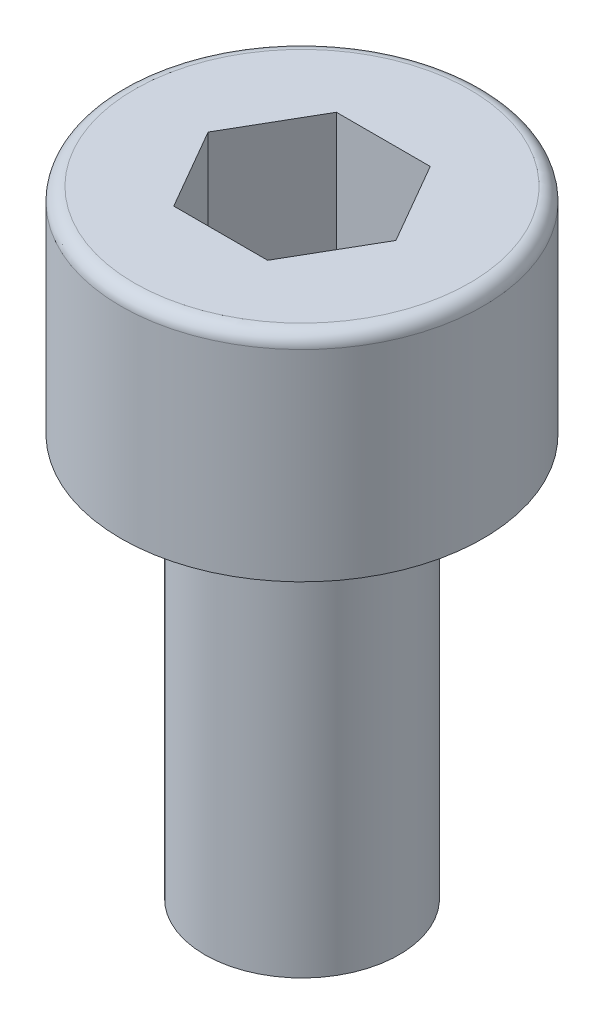
ISO-10303-21;
HEADER;
FILE_DESCRIPTION(('STEP AP214'),'2;1');
FILE_NAME('part.step','',(''),(''),'','','');
FILE_SCHEMA(('AUTOMOTIVE_DESIGN { 1 0 10303 214 1 1 1 1 }'));
ENDSEC;
DATA;
#1=APPLICATION_CONTEXT('core data for automotive mechanical design processes');
#2=APPLICATION_PROTOCOL_DEFINITION('international standard','automotive_design',2000,#1);
#3=PRODUCT_CONTEXT('',#1,'mechanical');
#4=PRODUCT('Part','Part','',(#3));
#5=PRODUCT_RELATED_PRODUCT_CATEGORY('part','',(#4));
#6=PRODUCT_DEFINITION_FORMATION('','',#4);
#7=PRODUCT_DEFINITION_CONTEXT('part definition',#1,'design');
#8=PRODUCT_DEFINITION('design','',#6,#7);
#9=PRODUCT_DEFINITION_SHAPE('','',#8);
#10=(LENGTH_UNIT() NAMED_UNIT(*) SI_UNIT(.MILLI.,.METRE.));
#11=(NAMED_UNIT(*) PLANE_ANGLE_UNIT() SI_UNIT($,.RADIAN.));
#12=(NAMED_UNIT(*) SI_UNIT($,.STERADIAN.) SOLID_ANGLE_UNIT());
#13=UNCERTAINTY_MEASURE_WITH_UNIT(LENGTH_MEASURE(1.E-05),#10,'distance_accuracy_value','');
#14=(GEOMETRIC_REPRESENTATION_CONTEXT(3) GLOBAL_UNCERTAINTY_ASSIGNED_CONTEXT((#13)) GLOBAL_UNIT_ASSIGNED_CONTEXT((#10,
#11,#12)) REPRESENTATION_CONTEXT('',''));
#15=CARTESIAN_POINT('',(0.,0.,0.));
#16=DIRECTION('',(0.,0.,1.));
#17=DIRECTION('',(1.,0.,0.));
#18=AXIS2_PLACEMENT_3D('',#15,#16,#17);
#19=CARTESIAN_POINT('',(0.,3.2,0.));
#20=DIRECTION('',(0.,-1.,0.));
#21=DIRECTION('',(0.,0.,-1.));
#22=AXIS2_PLACEMENT_3D('',#19,#20,#21);
#23=CYLINDRICAL_SURFACE('',#22,2.7);
#24=CARTESIAN_POINT('',(0.,3.,0.));
#25=DIRECTION('',(0.,1.,0.));
#26=DIRECTION('',(0.,0.,1.));
#27=AXIS2_PLACEMENT_3D('',#24,#25,#26);
#28=CIRCLE('',#27,2.7);
#29=CARTESIAN_POINT('',(0.,3.,2.7));
#30=VERTEX_POINT('',#29);
#31=EDGE_CURVE('E37',#30,#30,#28,.F.);
#32=ORIENTED_EDGE('',*,*,#31,.T.);
#33=EDGE_LOOP('',(#32));
#34=FACE_BOUND('',#33,.T.);
#35=CARTESIAN_POINT('',(0.,0.,0.));
#36=DIRECTION('',(0.,1.,0.));
#37=DIRECTION('',(0.,0.,1.));
#38=AXIS2_PLACEMENT_3D('',#35,#36,#37);
#39=CIRCLE('',#38,2.7);
#40=CARTESIAN_POINT('',(0.,0.,2.7));
#41=VERTEX_POINT('',#40);
#42=EDGE_CURVE('E137',#41,#41,#39,.T.);
#43=ORIENTED_EDGE('',*,*,#42,.T.);
#44=EDGE_LOOP('',(#43));
#45=FACE_BOUND('',#44,.T.);
#46=ADVANCED_FACE('F33',(#34,#45),#23,.T.);
#47=CARTESIAN_POINT('',(0.,3.2,0.));
#48=DIRECTION('',(0.,1.,0.));
#49=DIRECTION('',(0.,0.,1.));
#50=AXIS2_PLACEMENT_3D('',#47,#48,#49);
#51=PLANE('',#50);
#52=CARTESIAN_POINT('',(0.,3.2,0.));
#53=DIRECTION('',(0.,1.,0.));
#54=DIRECTION('',(0.,0.,1.));
#55=AXIS2_PLACEMENT_3D('',#52,#53,#54);
#56=CIRCLE('',#55,2.5);
#57=CARTESIAN_POINT('',(0.,3.2,2.5));
#58=VERTEX_POINT('',#57);
#59=EDGE_CURVE('E144',#58,#58,#56,.T.);
#60=ORIENTED_EDGE('',*,*,#59,.T.);
#61=EDGE_LOOP('',(#60));
#62=FACE_BOUND('',#61,.T.);
#63=DIRECTION('',(0.5,0.,-0.866025403784439));
#64=VECTOR('',#63,1.);
#65=CARTESIAN_POINT('',(0.7,3.2,1.21243556529821));
#66=LINE('',#65,#64);
#67=CARTESIAN_POINT('',(0.7,3.2,1.21243556529821));
#68=VERTEX_POINT('',#67);
#69=CARTESIAN_POINT('',(1.4,3.2,0.));
#70=VERTEX_POINT('',#69);
#71=EDGE_CURVE('E49',#68,#70,#66,.T.);
#72=ORIENTED_EDGE('',*,*,#71,.F.);
#73=DIRECTION('',(1.,0.,0.));
#74=VECTOR('',#73,1.);
#75=CARTESIAN_POINT('',(-0.7,3.2,1.21243556529821));
#76=LINE('',#75,#74);
#77=CARTESIAN_POINT('',(-0.7,3.2,1.21243556529821));
#78=VERTEX_POINT('',#77);
#79=EDGE_CURVE('E133',#78,#68,#76,.T.);
#80=ORIENTED_EDGE('',*,*,#79,.F.);
#81=DIRECTION('',(0.5,0.,0.866025403784439));
#82=VECTOR('',#81,1.);
#83=CARTESIAN_POINT('',(-1.4,3.2,0.));
#84=LINE('',#83,#82);
#85=CARTESIAN_POINT('',(-1.4,3.2,0.));
#86=VERTEX_POINT('',#85);
#87=EDGE_CURVE('E131',#86,#78,#84,.T.);
#88=ORIENTED_EDGE('',*,*,#87,.F.);
#89=DIRECTION('',(-0.5,0.,0.866025403784439));
#90=VECTOR('',#89,1.);
#91=CARTESIAN_POINT('',(-0.700000000000001,3.2,-1.21243556529821));
#92=LINE('',#91,#90);
#93=CARTESIAN_POINT('',(-0.700000000000001,3.2,-1.21243556529821));
#94=VERTEX_POINT('',#93);
#95=EDGE_CURVE('E97',#94,#86,#92,.T.);
#96=ORIENTED_EDGE('',*,*,#95,.F.);
#97=DIRECTION('',(-1.,0.,0.));
#98=VECTOR('',#97,1.);
#99=CARTESIAN_POINT('',(0.699999999999999,3.2,-1.21243556529821));
#100=LINE('',#99,#98);
#101=CARTESIAN_POINT('',(0.699999999999999,3.2,-1.21243556529821));
#102=VERTEX_POINT('',#101);
#103=EDGE_CURVE('E127',#102,#94,#100,.T.);
#104=ORIENTED_EDGE('',*,*,#103,.F.);
#105=DIRECTION('',(-0.5,0.,-0.866025403784439));
#106=VECTOR('',#105,1.);
#107=CARTESIAN_POINT('',(1.4,3.2,0.));
#108=LINE('',#107,#106);
#109=EDGE_CURVE('E123',#70,#102,#108,.T.);
#110=ORIENTED_EDGE('',*,*,#109,.F.);
#111=EDGE_LOOP('',(#72,#80,#88,#96,#104,#110));
#112=FACE_BOUND('',#111,.T.);
#113=ADVANCED_FACE('F166',(#62,#112),#51,.T.);
#114=CARTESIAN_POINT('',(0.,0.,0.));
#115=DIRECTION('',(0.,1.,0.));
#116=DIRECTION('',(0.,0.,1.));
#117=AXIS2_PLACEMENT_3D('',#114,#115,#116);
#118=PLANE('',#117);
#119=CARTESIAN_POINT('',(0.,0.,0.));
#120=DIRECTION('',(0.,-1.,0.));
#121=DIRECTION('',(0.,0.,-1.));
#122=AXIS2_PLACEMENT_3D('',#119,#120,#121);
#123=CIRCLE('',#122,1.45);
#124=CARTESIAN_POINT('',(0.,0.,-1.45));
#125=VERTEX_POINT('',#124);
#126=EDGE_CURVE('E11',#125,#125,#123,.T.);
#127=ORIENTED_EDGE('',*,*,#126,.F.);
#128=EDGE_LOOP('',(#127));
#129=FACE_BOUND('',#128,.T.);
#130=ORIENTED_EDGE('',*,*,#42,.F.);
#131=EDGE_LOOP('',(#130));
#132=FACE_BOUND('',#131,.T.);
#133=ADVANCED_FACE('F170',(#129,#132),#118,.F.);
#134=CARTESIAN_POINT('',(0.7,1.2,1.21243556529821));
#135=DIRECTION('',(0.866025403784439,0.,0.5));
#136=DIRECTION('',(0.5,0.,-0.866025403784439));
#137=AXIS2_PLACEMENT_3D('',#134,#135,#136);
#138=PLANE('',#137);
#139=ORIENTED_EDGE('',*,*,#71,.T.);
#140=DIRECTION('',(0.,1.,0.));
#141=VECTOR('',#140,1.);
#142=CARTESIAN_POINT('',(1.4,1.2,0.));
#143=LINE('',#142,#141);
#144=CARTESIAN_POINT('',(1.4,1.2,0.));
#145=VERTEX_POINT('',#144);
#146=EDGE_CURVE('E79',#145,#70,#143,.T.);
#147=ORIENTED_EDGE('',*,*,#146,.F.);
#148=DIRECTION('',(0.5,0.,-0.866025403784439));
#149=VECTOR('',#148,1.);
#150=CARTESIAN_POINT('',(0.7,1.2,1.21243556529821));
#151=LINE('',#150,#149);
#152=CARTESIAN_POINT('',(0.7,1.2,1.21243556529821));
#153=VERTEX_POINT('',#152);
#154=EDGE_CURVE('E135',#153,#145,#151,.T.);
#155=ORIENTED_EDGE('',*,*,#154,.F.);
#156=DIRECTION('',(0.,1.,0.));
#157=VECTOR('',#156,1.);
#158=CARTESIAN_POINT('',(0.7,1.2,1.21243556529821));
#159=LINE('',#158,#157);
#160=EDGE_CURVE('E57',#153,#68,#159,.T.);
#161=ORIENTED_EDGE('',*,*,#160,.T.);
#162=EDGE_LOOP('',(#139,#147,#155,#161));
#163=FACE_BOUND('',#162,.T.);
#164=ADVANCED_FACE('F174',(#163),#138,.F.);
#165=CARTESIAN_POINT('',(-0.7,1.2,1.21243556529821));
#166=DIRECTION('',(0.,0.,1.));
#167=DIRECTION('',(1.,0.,0.));
#168=AXIS2_PLACEMENT_3D('',#165,#166,#167);
#169=PLANE('',#168);
#170=ORIENTED_EDGE('',*,*,#79,.T.);
#171=ORIENTED_EDGE('',*,*,#160,.F.);
#172=DIRECTION('',(1.,0.,0.));
#173=VECTOR('',#172,1.);
#174=CARTESIAN_POINT('',(-0.7,1.2,1.21243556529821));
#175=LINE('',#174,#173);
#176=CARTESIAN_POINT('',(-0.7,1.2,1.21243556529821));
#177=VERTEX_POINT('',#176);
#178=EDGE_CURVE('E109',#177,#153,#175,.T.);
#179=ORIENTED_EDGE('',*,*,#178,.F.);
#180=DIRECTION('',(0.,1.,0.));
#181=VECTOR('',#180,1.);
#182=CARTESIAN_POINT('',(-0.7,1.2,1.21243556529821));
#183=LINE('',#182,#181);
#184=EDGE_CURVE('E101',#177,#78,#183,.T.);
#185=ORIENTED_EDGE('',*,*,#184,.T.);
#186=EDGE_LOOP('',(#170,#171,#179,#185));
#187=FACE_BOUND('',#186,.T.);
#188=ADVANCED_FACE('F179',(#187),#169,.F.);
#189=CARTESIAN_POINT('',(-1.4,1.2,0.));
#190=DIRECTION('',(-0.866025403784439,0.,0.5));
#191=DIRECTION('',(0.5,0.,0.866025403784439));
#192=AXIS2_PLACEMENT_3D('',#189,#190,#191);
#193=PLANE('',#192);
#194=ORIENTED_EDGE('',*,*,#87,.T.);
#195=ORIENTED_EDGE('',*,*,#184,.F.);
#196=DIRECTION('',(0.5,0.,0.866025403784439));
#197=VECTOR('',#196,1.);
#198=CARTESIAN_POINT('',(-1.4,1.2,0.));
#199=LINE('',#198,#197);
#200=CARTESIAN_POINT('',(-1.4,1.2,0.));
#201=VERTEX_POINT('',#200);
#202=EDGE_CURVE('E105',#201,#177,#199,.T.);
#203=ORIENTED_EDGE('',*,*,#202,.F.);
#204=DIRECTION('',(0.,1.,0.));
#205=VECTOR('',#204,1.);
#206=CARTESIAN_POINT('',(-1.4,1.2,0.));
#207=LINE('',#206,#205);
#208=EDGE_CURVE('E90',#201,#86,#207,.T.);
#209=ORIENTED_EDGE('',*,*,#208,.T.);
#210=EDGE_LOOP('',(#194,#195,#203,#209));
#211=FACE_BOUND('',#210,.T.);
#212=ADVANCED_FACE('F106',(#211),#193,.F.);
#213=CARTESIAN_POINT('',(-0.700000000000001,1.2,-1.21243556529821));
#214=DIRECTION('',(-0.866025403784439,0.,-0.5));
#215=DIRECTION('',(-0.5,0.,0.866025403784439));
#216=AXIS2_PLACEMENT_3D('',#213,#214,#215);
#217=PLANE('',#216);
#218=ORIENTED_EDGE('',*,*,#95,.T.);
#219=ORIENTED_EDGE('',*,*,#208,.F.);
#220=DIRECTION('',(-0.5,0.,0.866025403784439));
#221=VECTOR('',#220,1.);
#222=CARTESIAN_POINT('',(-0.700000000000001,1.2,-1.21243556529821));
#223=LINE('',#222,#221);
#224=CARTESIAN_POINT('',(-0.700000000000001,1.2,-1.21243556529821));
#225=VERTEX_POINT('',#224);
#226=EDGE_CURVE('E94',#225,#201,#223,.T.);
#227=ORIENTED_EDGE('',*,*,#226,.F.);
#228=DIRECTION('',(0.,1.,0.));
#229=VECTOR('',#228,1.);
#230=CARTESIAN_POINT('',(-0.700000000000001,1.2,-1.21243556529821));
#231=LINE('',#230,#229);
#232=EDGE_CURVE('E102',#225,#94,#231,.T.);
#233=ORIENTED_EDGE('',*,*,#232,.T.);
#234=EDGE_LOOP('',(#218,#219,#227,#233));
#235=FACE_BOUND('',#234,.T.);
#236=ADVANCED_FACE('F92',(#235),#217,.F.);
#237=CARTESIAN_POINT('',(0.699999999999999,1.2,-1.21243556529821));
#238=DIRECTION('',(0.,0.,-1.));
#239=DIRECTION('',(-1.,0.,0.));
#240=AXIS2_PLACEMENT_3D('',#237,#238,#239);
#241=PLANE('',#240);
#242=ORIENTED_EDGE('',*,*,#103,.T.);
#243=ORIENTED_EDGE('',*,*,#232,.F.);
#244=DIRECTION('',(-1.,0.,0.));
#245=VECTOR('',#244,1.);
#246=CARTESIAN_POINT('',(0.699999999999999,1.2,-1.21243556529821));
#247=LINE('',#246,#245);
#248=CARTESIAN_POINT('',(0.699999999999999,1.2,-1.21243556529821));
#249=VERTEX_POINT('',#248);
#250=EDGE_CURVE('E115',#249,#225,#247,.T.);
#251=ORIENTED_EDGE('',*,*,#250,.F.);
#252=DIRECTION('',(0.,1.,0.));
#253=VECTOR('',#252,1.);
#254=CARTESIAN_POINT('',(0.699999999999999,1.2,-1.21243556529821));
#255=LINE('',#254,#253);
#256=EDGE_CURVE('E140',#249,#102,#255,.T.);
#257=ORIENTED_EDGE('',*,*,#256,.T.);
#258=EDGE_LOOP('',(#242,#243,#251,#257));
#259=FACE_BOUND('',#258,.T.);
#260=ADVANCED_FACE('F182',(#259),#241,.F.);
#261=CARTESIAN_POINT('',(1.4,1.2,0.));
#262=DIRECTION('',(0.866025403784439,0.,-0.5));
#263=DIRECTION('',(-0.5,0.,-0.866025403784439));
#264=AXIS2_PLACEMENT_3D('',#261,#262,#263);
#265=PLANE('',#264);
#266=ORIENTED_EDGE('',*,*,#109,.T.);
#267=ORIENTED_EDGE('',*,*,#256,.F.);
#268=DIRECTION('',(-0.5,0.,-0.866025403784439));
#269=VECTOR('',#268,1.);
#270=CARTESIAN_POINT('',(1.4,1.2,0.));
#271=LINE('',#270,#269);
#272=EDGE_CURVE('E117',#145,#249,#271,.T.);
#273=ORIENTED_EDGE('',*,*,#272,.F.);
#274=ORIENTED_EDGE('',*,*,#146,.T.);
#275=EDGE_LOOP('',(#266,#267,#273,#274));
#276=FACE_BOUND('',#275,.T.);
#277=ADVANCED_FACE('F163',(#276),#265,.F.);
#278=CARTESIAN_POINT('',(0.,1.2,0.));
#279=DIRECTION('',(0.,1.,0.));
#280=DIRECTION('',(0.,0.,1.));
#281=AXIS2_PLACEMENT_3D('',#278,#279,#280);
#282=PLANE('',#281);
#283=ORIENTED_EDGE('',*,*,#154,.T.);
#284=ORIENTED_EDGE('',*,*,#272,.T.);
#285=ORIENTED_EDGE('',*,*,#250,.T.);
#286=ORIENTED_EDGE('',*,*,#226,.T.);
#287=ORIENTED_EDGE('',*,*,#202,.T.);
#288=ORIENTED_EDGE('',*,*,#178,.T.);
#289=EDGE_LOOP('',(#283,#284,#285,#286,#287,#288));
#290=FACE_BOUND('',#289,.T.);
#291=ADVANCED_FACE('F112',(#290),#282,.T.);
#292=CARTESIAN_POINT('',(0.,3.,0.));
#293=DIRECTION('',(0.,1.,0.));
#294=DIRECTION('',(0.,0.,1.));
#295=AXIS2_PLACEMENT_3D('',#292,#293,#294);
#296=TOROIDAL_SURFACE('',#295,2.5,0.2);
#297=ORIENTED_EDGE('',*,*,#31,.F.);
#298=EDGE_LOOP('',(#297));
#299=FACE_BOUND('',#298,.T.);
#300=ORIENTED_EDGE('',*,*,#59,.F.);
#301=EDGE_LOOP('',(#300));
#302=FACE_BOUND('',#301,.T.);
#303=ADVANCED_FACE('F35',(#299,#302),#296,.T.);
#304=CARTESIAN_POINT('',(0.,-6.,0.));
#305=DIRECTION('',(0.,1.,0.));
#306=DIRECTION('',(0.,0.,1.));
#307=AXIS2_PLACEMENT_3D('',#304,#305,#306);
#308=CYLINDRICAL_SURFACE('',#307,1.45);
#309=CARTESIAN_POINT('',(0.,-6.,0.));
#310=DIRECTION('',(0.,-1.,0.));
#311=DIRECTION('',(0.,0.,-1.));
#312=AXIS2_PLACEMENT_3D('',#309,#310,#311);
#313=CIRCLE('',#312,1.45);
#314=CARTESIAN_POINT('',(0.,-6.,-1.45));
#315=VERTEX_POINT('',#314);
#316=EDGE_CURVE('E124',#315,#315,#313,.T.);
#317=ORIENTED_EDGE('',*,*,#316,.F.);
#318=EDGE_LOOP('',(#317));
#319=FACE_BOUND('',#318,.T.);
#320=ORIENTED_EDGE('',*,*,#126,.T.);
#321=EDGE_LOOP('',(#320));
#322=FACE_BOUND('',#321,.T.);
#323=ADVANCED_FACE('F155',(#319,#322),#308,.T.);
#324=CARTESIAN_POINT('',(0.,-6.,0.));
#325=DIRECTION('',(0.,-1.,0.));
#326=DIRECTION('',(0.,0.,-1.));
#327=AXIS2_PLACEMENT_3D('',#324,#325,#326);
#328=PLANE('',#327);
#329=ORIENTED_EDGE('',*,*,#316,.T.);
#330=EDGE_LOOP('',(#329));
#331=FACE_BOUND('',#330,.T.);
#332=ADVANCED_FACE('F160',(#331),#328,.T.);
#333=CLOSED_SHELL('',(#46,#113,#133,#164,#188,#212,#236,#260,#277,#291,#303,#323,#332));
#334=MANIFOLD_SOLID_BREP('B2',#333);
#335=ADVANCED_BREP_SHAPE_REPRESENTATION('',(#18,#334),#14);
#336=SHAPE_DEFINITION_REPRESENTATION(#9,#335);
ENDSEC;
END-ISO-10303-21;
